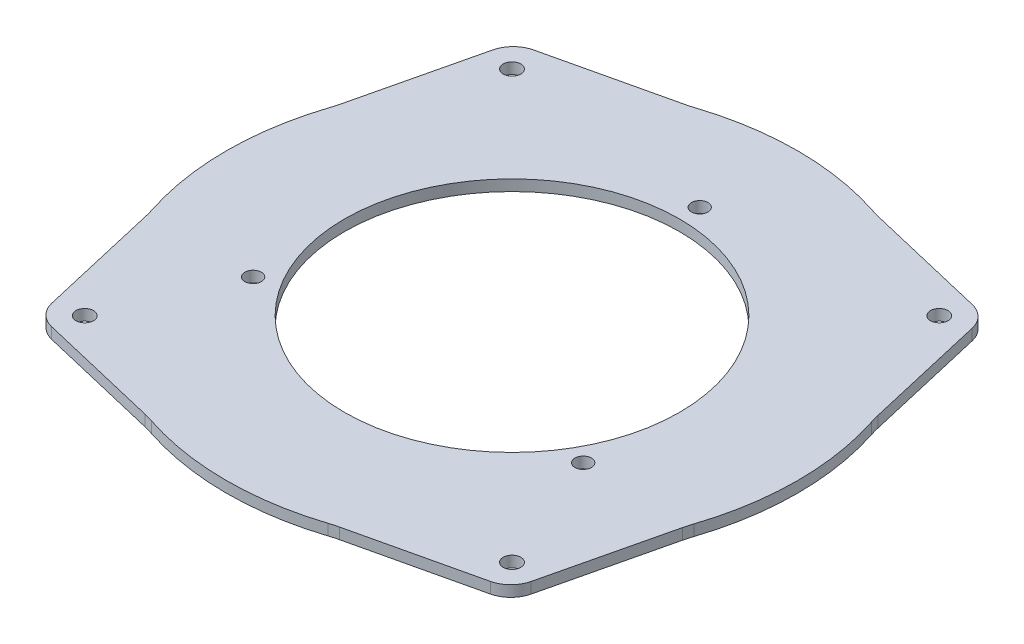
ISO-10303-21;
HEADER;
FILE_DESCRIPTION(('STEP AP214'),'2;1');
FILE_NAME('part.step','',(''),(''),'','','');
FILE_SCHEMA(('AUTOMOTIVE_DESIGN { 1 0 10303 214 1 1 1 1 }'));
ENDSEC;
DATA;
#1=APPLICATION_CONTEXT('core data for automotive mechanical design processes');
#2=APPLICATION_PROTOCOL_DEFINITION('international standard','automotive_design',2000,#1);
#3=PRODUCT_CONTEXT('',#1,'mechanical');
#4=PRODUCT('Part','Part','',(#3));
#5=PRODUCT_RELATED_PRODUCT_CATEGORY('part','',(#4));
#6=PRODUCT_DEFINITION_FORMATION('','',#4);
#7=PRODUCT_DEFINITION_CONTEXT('part definition',#1,'design');
#8=PRODUCT_DEFINITION('design','',#6,#7);
#9=PRODUCT_DEFINITION_SHAPE('','',#8);
#10=(LENGTH_UNIT() NAMED_UNIT(*) SI_UNIT(.MILLI.,.METRE.));
#11=(NAMED_UNIT(*) PLANE_ANGLE_UNIT() SI_UNIT($,.RADIAN.));
#12=(NAMED_UNIT(*) SI_UNIT($,.STERADIAN.) SOLID_ANGLE_UNIT());
#13=UNCERTAINTY_MEASURE_WITH_UNIT(LENGTH_MEASURE(1.E-05),#10,'distance_accuracy_value','');
#14=(GEOMETRIC_REPRESENTATION_CONTEXT(3) GLOBAL_UNCERTAINTY_ASSIGNED_CONTEXT((#13)) GLOBAL_UNIT_ASSIGNED_CONTEXT((#10,
#11,#12)) REPRESENTATION_CONTEXT('',''));
#15=CARTESIAN_POINT('',(0.,0.,0.));
#16=DIRECTION('',(0.,0.,1.));
#17=DIRECTION('',(1.,0.,0.));
#18=AXIS2_PLACEMENT_3D('',#15,#16,#17);
#19=CARTESIAN_POINT('',(-22.1453568798844,2.,-68.5097304670067));
#20=DIRECTION('',(0.,1.,0.));
#21=DIRECTION('',(0.,0.,1.));
#22=AXIS2_PLACEMENT_3D('',#19,#20,#21);
#23=PLANE('',#22);
#24=CARTESIAN_POINT('',(38.8907000000007,2.,38.8907000000005));
#25=DIRECTION('',(0.,1.,0.));
#26=DIRECTION('',(0.,0.,1.));
#27=AXIS2_PLACEMENT_3D('',#24,#25,#26);
#28=CIRCLE('',#27,1.6);
#29=CARTESIAN_POINT('',(38.8907000000007,2.,40.4907000000005));
#30=VERTEX_POINT('',#29);
#31=EDGE_CURVE('E527',#30,#30,#28,.T.);
#32=ORIENTED_EDGE('',*,*,#31,.F.);
#33=EDGE_LOOP('',(#32));
#34=FACE_BOUND('',#33,.T.);
#35=CARTESIAN_POINT('',(29.6726964084282,2.,16.7172515373909));
#36=DIRECTION('',(0.,1.,0.));
#37=DIRECTION('',(0.,0.,1.));
#38=AXIS2_PLACEMENT_3D('',#35,#36,#37);
#39=CIRCLE('',#38,1.5);
#40=CARTESIAN_POINT('',(29.6726964084282,2.,18.2172515373909));
#41=VERTEX_POINT('',#40);
#42=EDGE_CURVE('E511',#41,#41,#39,.T.);
#43=ORIENTED_EDGE('',*,*,#42,.F.);
#44=EDGE_LOOP('',(#43));
#45=FACE_BOUND('',#44,.T.);
#46=CARTESIAN_POINT('',(-38.8906999999993,2.,-38.8906999999996));
#47=DIRECTION('',(0.,1.,0.));
#48=DIRECTION('',(0.,0.,1.));
#49=AXIS2_PLACEMENT_3D('',#46,#47,#48);
#50=CIRCLE('',#49,1.6);
#51=CARTESIAN_POINT('',(-38.8906999999993,2.,-37.2906999999996));
#52=VERTEX_POINT('',#51);
#53=EDGE_CURVE('E495',#52,#52,#50,.T.);
#54=ORIENTED_EDGE('',*,*,#53,.F.);
#55=EDGE_LOOP('',(#54));
#56=FACE_BOUND('',#55,.T.);
#57=CARTESIAN_POINT('',(3.88578058618805E-13,2.,3.85108611666851E-13));
#58=DIRECTION('',(0.,1.,0.));
#59=DIRECTION('',(0.,0.,1.));
#60=AXIS2_PLACEMENT_3D('',#57,#58,#59);
#61=CIRCLE('',#60,30.5);
#62=CARTESIAN_POINT('',(3.88578058618805E-13,2.,30.5000000000004));
#63=VERTEX_POINT('',#62);
#64=EDGE_CURVE('E243',#63,#63,#61,.T.);
#65=ORIENTED_EDGE('',*,*,#64,.F.);
#66=EDGE_LOOP('',(#65));
#67=FACE_BOUND('',#66,.T.);
#68=CARTESIAN_POINT('',(-22.1453568798844,2.,-68.5097304670067));
#69=DIRECTION('',(0.,-1.,0.));
#70=DIRECTION('',(0.,0.,1.));
#71=AXIS2_PLACEMENT_3D('',#68,#69,#70);
#72=CIRCLE('',#71,20.);
#73=CARTESIAN_POINT('',(-15.9938688576939,2.,-49.4792497817258));
#74=VERTEX_POINT('',#73);
#75=CARTESIAN_POINT('',(-17.6338465789146,2.,-49.0252167495889));
#76=VERTEX_POINT('',#75);
#77=EDGE_CURVE('E310',#74,#76,#72,.T.);
#78=ORIENTED_EDGE('',*,*,#77,.T.);
#79=DIRECTION('',(-0.974225685870893,0.,0.225575515048483));
#80=VECTOR('',#79,1.);
#81=CARTESIAN_POINT('',(-39.9140995803705,2.,-43.8663715055106));
#82=LINE('',#81,#80);
#83=CARTESIAN_POINT('',(-39.9140995803705,2.,-43.8663715055106));
#84=VERTEX_POINT('',#83);
#85=EDGE_CURVE('E146',#76,#84,#82,.T.);
#86=ORIENTED_EDGE('',*,*,#85,.T.);
#87=CARTESIAN_POINT('',(-38.7862220051282,2.,-38.9952430761568));
#88=DIRECTION('',(0.,1.,0.));
#89=DIRECTION('',(0.,0.,1.));
#90=AXIS2_PLACEMENT_3D('',#87,#88,#89);
#91=CIRCLE('',#90,4.99999999999932);
#92=CARTESIAN_POINT('',(-43.651218264907,2.,-40.149284406583));
#93=VERTEX_POINT('',#92);
#94=EDGE_CURVE('E395',#84,#93,#91,.T.);
#95=ORIENTED_EDGE('',*,*,#94,.T.);
#96=DIRECTION('',(-0.230808266085291,0.,0.972999251955879));
#97=VECTOR('',#96,1.);
#98=CARTESIAN_POINT('',(-48.9297349759596,2.,-17.8970795856653));
#99=LINE('',#98,#97);
#100=CARTESIAN_POINT('',(-48.9297349759596,2.,-17.8970795856653));
#101=VERTEX_POINT('',#100);
#102=EDGE_CURVE('E413',#93,#101,#99,.T.);
#103=ORIENTED_EDGE('',*,*,#102,.T.);
#104=CARTESIAN_POINT('',(-68.3897200150771,2.,-22.5132449073711));
#105=DIRECTION('',(0.,-1.,0.));
#106=DIRECTION('',(0.,0.,1.));
#107=AXIS2_PLACEMENT_3D('',#104,#105,#106);
#108=CIRCLE('',#107,19.9999999999999);
#109=CARTESIAN_POINT('',(-49.3925755664448,2.,-16.259565766434));
#110=VERTEX_POINT('',#109);
#111=EDGE_CURVE('E409',#101,#110,#108,.T.);
#112=ORIENTED_EDGE('',*,*,#111,.T.);
#113=CARTESIAN_POINT('',(3.88578058618805E-13,2.,3.85108611666851E-13));
#114=DIRECTION('',(0.,1.,0.));
#115=DIRECTION('',(0.,0.,1.));
#116=AXIS2_PLACEMENT_3D('',#113,#114,#115);
#117=CIRCLE('',#116,52.);
#118=CARTESIAN_POINT('',(-49.4792497817297,2.,15.9938688576957));
#119=VERTEX_POINT('',#118);
#120=EDGE_CURVE('E412',#110,#119,#117,.T.);
#121=ORIENTED_EDGE('',*,*,#120,.T.);
#122=CARTESIAN_POINT('',(-68.5097304670106,2.,22.145356879886));
#123=DIRECTION('',(0.,-1.,0.));
#124=DIRECTION('',(0.,0.,1.));
#125=AXIS2_PLACEMENT_3D('',#122,#123,#124);
#126=CIRCLE('',#125,20.0000000000001);
#127=CARTESIAN_POINT('',(-49.0252167495927,2.,17.6338465789162));
#128=VERTEX_POINT('',#127);
#129=EDGE_CURVE('E417',#119,#128,#126,.T.);
#130=ORIENTED_EDGE('',*,*,#129,.T.);
#131=DIRECTION('',(0.225575515048492,0.,0.974225685870891));
#132=VECTOR('',#131,1.);
#133=CARTESIAN_POINT('',(-43.8663715055141,2.,39.9140995803726));
#134=LINE('',#133,#132);
#135=CARTESIAN_POINT('',(-43.8663715055141,2.,39.9140995803726));
#136=VERTEX_POINT('',#135);
#137=EDGE_CURVE('E424',#128,#136,#134,.T.);
#138=ORIENTED_EDGE('',*,*,#137,.T.);
#139=CARTESIAN_POINT('',(-38.9952430761602,2.,38.7862220051302));
#140=DIRECTION('',(0.,1.,0.));
#141=DIRECTION('',(0.,0.,1.));
#142=AXIS2_PLACEMENT_3D('',#139,#140,#141);
#143=CIRCLE('',#142,4.99999999999942);
#144=CARTESIAN_POINT('',(-40.1492844065865,2.,43.6512182649091));
#145=VERTEX_POINT('',#144);
#146=EDGE_CURVE('E427',#136,#145,#143,.T.);
#147=ORIENTED_EDGE('',*,*,#146,.T.);
#148=DIRECTION('',(0.972999251955882,0.,0.230808266085283));
#149=VECTOR('',#148,1.);
#150=CARTESIAN_POINT('',(-17.8970795856709,2.,48.9297349759609));
#151=LINE('',#150,#149);
#152=CARTESIAN_POINT('',(-17.8970795856709,2.,48.9297349759609));
#153=VERTEX_POINT('',#152);
#154=EDGE_CURVE('E430',#145,#153,#151,.T.);
#155=ORIENTED_EDGE('',*,*,#154,.T.);
#156=CARTESIAN_POINT('',(-22.5132449073765,2.,68.3897200150786));
#157=DIRECTION('',(0.,-1.,0.));
#158=DIRECTION('',(0.,0.,1.));
#159=AXIS2_PLACEMENT_3D('',#156,#157,#158);
#160=CIRCLE('',#159,20.);
#161=CARTESIAN_POINT('',(-16.2595657664402,2.,49.3925755664458));
#162=VERTEX_POINT('',#161);
#163=EDGE_CURVE('E433',#153,#162,#160,.T.);
#164=ORIENTED_EDGE('',*,*,#163,.T.);
#165=CARTESIAN_POINT('',(-4.50517509083709E-12,2.,2.29418633236077E-12));
#166=DIRECTION('',(0.,1.,0.));
#167=DIRECTION('',(0.,0.,1.));
#168=AXIS2_PLACEMENT_3D('',#165,#166,#167);
#169=CIRCLE('',#168,51.9999999999989);
#170=CARTESIAN_POINT('',(15.9938688576903,2.,49.4792497817314));
#171=VERTEX_POINT('',#170);
#172=EDGE_CURVE('E436',#162,#171,#169,.T.);
#173=ORIENTED_EDGE('',*,*,#172,.T.);
#174=CARTESIAN_POINT('',(22.1453568798804,2.,68.5097304670124));
#175=DIRECTION('',(0.,-1.,0.));
#176=DIRECTION('',(0.,0.,1.));
#177=AXIS2_PLACEMENT_3D('',#174,#175,#176);
#178=CIRCLE('',#177,20.);
#179=CARTESIAN_POINT('',(17.633846578909,2.,49.0252167495949));
#180=VERTEX_POINT('',#179);
#181=EDGE_CURVE('E439',#171,#180,#178,.T.);
#182=ORIENTED_EDGE('',*,*,#181,.T.);
#183=DIRECTION('',(0.974225685870891,0.,-0.22557551504849));
#184=VECTOR('',#183,1.);
#185=CARTESIAN_POINT('',(39.9140995803634,2.,43.8663715055168));
#186=LINE('',#185,#184);
#187=CARTESIAN_POINT('',(39.9140995803634,2.,43.8663715055168));
#188=VERTEX_POINT('',#187);
#189=EDGE_CURVE('E442',#180,#188,#186,.T.);
#190=ORIENTED_EDGE('',*,*,#189,.T.);
#191=CARTESIAN_POINT('',(38.7862220051211,2.,38.995243076163));
#192=DIRECTION('',(0.,1.,0.));
#193=DIRECTION('',(0.,0.,1.));
#194=AXIS2_PLACEMENT_3D('',#191,#192,#193);
#195=CIRCLE('',#194,4.99999999999953);
#196=CARTESIAN_POINT('',(43.6512182649001,2.,40.1492844065893));
#197=VERTEX_POINT('',#196);
#198=EDGE_CURVE('E445',#188,#197,#195,.T.);
#199=ORIENTED_EDGE('',*,*,#198,.T.);
#200=DIRECTION('',(0.230808266085281,0.,-0.972999251955882));
#201=VECTOR('',#200,1.);
#202=CARTESIAN_POINT('',(48.9297349759409,2.,17.8970795857211));
#203=LINE('',#202,#201);
#204=CARTESIAN_POINT('',(48.9297349759409,2.,17.8970795857211));
#205=VERTEX_POINT('',#204);
#206=EDGE_CURVE('E448',#197,#205,#203,.T.);
#207=ORIENTED_EDGE('',*,*,#206,.T.);
#208=CARTESIAN_POINT('',(68.3897200150589,2.,22.5132449074268));
#209=DIRECTION('',(0.,-1.,0.));
#210=DIRECTION('',(0.,0.,1.));
#211=AXIS2_PLACEMENT_3D('',#208,#209,#210);
#212=CIRCLE('',#211,20.0000000000004);
#213=CARTESIAN_POINT('',(49.3925755664309,2.,16.2595657664749));
#214=VERTEX_POINT('',#213);
#215=EDGE_CURVE('E451',#205,#214,#212,.T.);
#216=ORIENTED_EDGE('',*,*,#215,.T.);
#217=CARTESIAN_POINT('',(-1.04655030013431E-12,2.,2.06336822739891E-13));
#218=DIRECTION('',(0.,1.,0.));
#219=DIRECTION('',(0.,0.,1.));
#220=AXIS2_PLACEMENT_3D('',#217,#218,#219);
#221=CIRCLE('',#220,52.);
#222=CARTESIAN_POINT('',(49.4792497817234,2.,-15.993868857713));
#223=VERTEX_POINT('',#222);
#224=EDGE_CURVE('E454',#214,#223,#221,.T.);
#225=ORIENTED_EDGE('',*,*,#224,.T.);
#226=CARTESIAN_POINT('',(68.5097304670016,2.,-22.1453568799102));
#227=DIRECTION('',(0.,-1.,0.));
#228=DIRECTION('',(0.,0.,1.));
#229=AXIS2_PLACEMENT_3D('',#226,#227,#228);
#230=CIRCLE('',#229,19.9999999999995);
#231=CARTESIAN_POINT('',(49.0252167495842,2.,-17.6338465789407));
#232=VERTEX_POINT('',#231);
#233=EDGE_CURVE('E457',#223,#232,#230,.T.);
#234=ORIENTED_EDGE('',*,*,#233,.T.);
#235=DIRECTION('',(-0.22557551504848,0.,-0.974225685870894));
#236=VECTOR('',#235,1.);
#237=CARTESIAN_POINT('',(43.8663715055134,2.,-39.9140995803654));
#238=LINE('',#237,#236);
#239=CARTESIAN_POINT('',(43.8663715055134,2.,-39.9140995803654));
#240=VERTEX_POINT('',#239);
#241=EDGE_CURVE('E460',#232,#240,#238,.T.);
#242=ORIENTED_EDGE('',*,*,#241,.T.);
#243=CARTESIAN_POINT('',(38.9952430761595,2.,-38.7862220051232));
#244=DIRECTION('',(0.,1.,0.));
#245=DIRECTION('',(0.,0.,1.));
#246=AXIS2_PLACEMENT_3D('',#243,#244,#245);
#247=CIRCLE('',#246,4.9999999999994);
#248=CARTESIAN_POINT('',(40.1492844065859,2.,-43.651218264902));
#249=VERTEX_POINT('',#248);
#250=EDGE_CURVE('E214',#240,#249,#247,.T.);
#251=ORIENTED_EDGE('',*,*,#250,.T.);
#252=DIRECTION('',(-0.97299925195588,0.,-0.230808266085289));
#253=VECTOR('',#252,1.);
#254=CARTESIAN_POINT('',(17.897079585663,2.,-48.9297349759557));
#255=LINE('',#254,#253);
#256=CARTESIAN_POINT('',(17.897079585663,2.,-48.9297349759557));
#257=VERTEX_POINT('',#256);
#258=EDGE_CURVE('E207',#249,#257,#255,.T.);
#259=ORIENTED_EDGE('',*,*,#258,.T.);
#260=CARTESIAN_POINT('',(22.5132449073689,2.,-68.3897200150733));
#261=DIRECTION('',(0.,-1.,0.));
#262=DIRECTION('',(0.,0.,1.));
#263=AXIS2_PLACEMENT_3D('',#260,#261,#262);
#264=CIRCLE('',#263,19.9999999999999);
#265=CARTESIAN_POINT('',(16.2595657664326,2.,-49.3925755664406));
#266=VERTEX_POINT('',#265);
#267=EDGE_CURVE('E211',#257,#266,#264,.T.);
#268=ORIENTED_EDGE('',*,*,#267,.T.);
#269=CARTESIAN_POINT('',(-2.29687533889309E-12,2.,4.40669160380655E-12));
#270=DIRECTION('',(0.,1.,0.));
#271=DIRECTION('',(0.,0.,1.));
#272=AXIS2_PLACEMENT_3D('',#269,#270,#271);
#273=CIRCLE('',#272,52.);
#274=EDGE_CURVE('E57',#266,#74,#273,.T.);
#275=ORIENTED_EDGE('',*,*,#274,.T.);
#276=EDGE_LOOP('',(#78,#86,#95,#103,#112,#121,#130,#138,#147,#155,#164,#173,#182,#190,#199,#207,
#216,#225,#234,#242,#251,#259,#268,#275));
#277=FACE_BOUND('',#276,.T.);
#278=CARTESIAN_POINT('',(7.07767178198537E-13,2.,-34.173997099809));
#279=DIRECTION('',(0.,1.,0.));
#280=DIRECTION('',(0.,0.,1.));
#281=AXIS2_PLACEMENT_3D('',#278,#279,#280);
#282=CIRCLE('',#281,1.5);
#283=CARTESIAN_POINT('',(7.07767178198537E-13,2.,-32.673997099809));
#284=VERTEX_POINT('',#283);
#285=EDGE_CURVE('E487',#284,#284,#282,.T.);
#286=ORIENTED_EDGE('',*,*,#285,.F.);
#287=EDGE_LOOP('',(#286));
#288=FACE_BOUND('',#287,.T.);
#289=CARTESIAN_POINT('',(-29.6726964084278,2.,17.4567455624193));
#290=DIRECTION('',(0.,1.,0.));
#291=DIRECTION('',(0.,0.,1.));
#292=AXIS2_PLACEMENT_3D('',#289,#290,#291);
#293=CIRCLE('',#292,1.5);
#294=CARTESIAN_POINT('',(-29.6726964084278,2.,18.9567455624193));
#295=VERTEX_POINT('',#294);
#296=EDGE_CURVE('E503',#295,#295,#293,.T.);
#297=ORIENTED_EDGE('',*,*,#296,.F.);
#298=EDGE_LOOP('',(#297));
#299=FACE_BOUND('',#298,.T.);
#300=CARTESIAN_POINT('',(38.8907000000007,2.,-38.8906999999996));
#301=DIRECTION('',(0.,1.,0.));
#302=DIRECTION('',(0.,0.,-1.));
#303=AXIS2_PLACEMENT_3D('',#300,#301,#302);
#304=CIRCLE('',#303,1.6);
#305=CARTESIAN_POINT('',(38.8907000000007,2.,-40.4906999999996));
#306=VERTEX_POINT('',#305);
#307=EDGE_CURVE('E519',#306,#306,#304,.T.);
#308=ORIENTED_EDGE('',*,*,#307,.F.);
#309=EDGE_LOOP('',(#308));
#310=FACE_BOUND('',#309,.T.);
#311=CARTESIAN_POINT('',(-38.8906999999993,2.,38.8907000000005));
#312=DIRECTION('',(0.,1.,0.));
#313=DIRECTION('',(0.,0.,-1.));
#314=AXIS2_PLACEMENT_3D('',#311,#312,#313);
#315=CIRCLE('',#314,1.6);
#316=CARTESIAN_POINT('',(-38.8906999999993,2.,37.2907000000005));
#317=VERTEX_POINT('',#316);
#318=EDGE_CURVE('E535',#317,#317,#315,.T.);
#319=ORIENTED_EDGE('',*,*,#318,.F.);
#320=EDGE_LOOP('',(#319));
#321=FACE_BOUND('',#320,.T.);
#322=ADVANCED_FACE('F39',(#34,#45,#56,#67,#277,#288,#299,#310,#321),#23,.T.);
#323=CARTESIAN_POINT('',(-22.1453568798844,0.,-68.5097304670067));
#324=DIRECTION('',(0.,1.,0.));
#325=DIRECTION('',(0.,0.,1.));
#326=AXIS2_PLACEMENT_3D('',#323,#324,#325);
#327=PLANE('',#326);
#328=CARTESIAN_POINT('',(-22.1453568798844,0.,-68.5097304670067));
#329=DIRECTION('',(0.,-1.,0.));
#330=DIRECTION('',(0.,0.,1.));
#331=AXIS2_PLACEMENT_3D('',#328,#329,#330);
#332=CIRCLE('',#331,20.);
#333=CARTESIAN_POINT('',(-15.9938688576939,0.,-49.4792497817258));
#334=VERTEX_POINT('',#333);
#335=CARTESIAN_POINT('',(-17.6338465789146,0.,-49.0252167495889));
#336=VERTEX_POINT('',#335);
#337=EDGE_CURVE('E238',#334,#336,#332,.T.);
#338=ORIENTED_EDGE('',*,*,#337,.F.);
#339=CARTESIAN_POINT('',(3.88578058618805E-13,0.,3.85108611666851E-13));
#340=DIRECTION('',(0.,1.,0.));
#341=DIRECTION('',(0.,0.,1.));
#342=AXIS2_PLACEMENT_3D('',#339,#340,#341);
#343=CIRCLE('',#342,51.9999999999959);
#344=CARTESIAN_POINT('',(16.2595657664326,0.,-49.3925755664406));
#345=VERTEX_POINT('',#344);
#346=EDGE_CURVE('E134',#345,#334,#343,.T.);
#347=ORIENTED_EDGE('',*,*,#346,.F.);
#348=CARTESIAN_POINT('',(22.5132449073689,0.,-68.3897200150733));
#349=DIRECTION('',(0.,-1.,0.));
#350=DIRECTION('',(0.,0.,1.));
#351=AXIS2_PLACEMENT_3D('',#348,#349,#350);
#352=CIRCLE('',#351,19.9999999999999);
#353=CARTESIAN_POINT('',(17.897079585663,0.,-48.9297349759557));
#354=VERTEX_POINT('',#353);
#355=EDGE_CURVE('E305',#354,#345,#352,.T.);
#356=ORIENTED_EDGE('',*,*,#355,.F.);
#357=DIRECTION('',(-0.97299925195588,0.,-0.230808266085289));
#358=VECTOR('',#357,1.);
#359=CARTESIAN_POINT('',(17.897079585663,0.,-48.9297349759557));
#360=LINE('',#359,#358);
#361=CARTESIAN_POINT('',(40.1492844065859,0.,-43.651218264902));
#362=VERTEX_POINT('',#361);
#363=EDGE_CURVE('E224',#362,#354,#360,.T.);
#364=ORIENTED_EDGE('',*,*,#363,.F.);
#365=CARTESIAN_POINT('',(38.9952430761595,0.,-38.7862220051232));
#366=DIRECTION('',(0.,1.,0.));
#367=DIRECTION('',(0.,0.,1.));
#368=AXIS2_PLACEMENT_3D('',#365,#366,#367);
#369=CIRCLE('',#368,4.9999999999994);
#370=CARTESIAN_POINT('',(43.8663715055134,0.,-39.9140995803654));
#371=VERTEX_POINT('',#370);
#372=EDGE_CURVE('E300',#371,#362,#369,.T.);
#373=ORIENTED_EDGE('',*,*,#372,.F.);
#374=DIRECTION('',(-0.22557551504848,0.,-0.974225685870894));
#375=VECTOR('',#374,1.);
#376=CARTESIAN_POINT('',(43.8663715055134,0.,-39.9140995803654));
#377=LINE('',#376,#375);
#378=CARTESIAN_POINT('',(49.0252167495842,0.,-17.6338465789407));
#379=VERTEX_POINT('',#378);
#380=EDGE_CURVE('E297',#379,#371,#377,.T.);
#381=ORIENTED_EDGE('',*,*,#380,.F.);
#382=CARTESIAN_POINT('',(68.5097304670016,0.,-22.1453568799102));
#383=DIRECTION('',(0.,-1.,0.));
#384=DIRECTION('',(0.,0.,1.));
#385=AXIS2_PLACEMENT_3D('',#382,#383,#384);
#386=CIRCLE('',#385,19.9999999999995);
#387=CARTESIAN_POINT('',(49.4792497817234,0.,-15.993868857713));
#388=VERTEX_POINT('',#387);
#389=EDGE_CURVE('E294',#388,#379,#386,.T.);
#390=ORIENTED_EDGE('',*,*,#389,.F.);
#391=CARTESIAN_POINT('',(-1.04655030013431E-12,0.,2.06336822739891E-13));
#392=DIRECTION('',(0.,1.,0.));
#393=DIRECTION('',(0.,0.,1.));
#394=AXIS2_PLACEMENT_3D('',#391,#392,#393);
#395=CIRCLE('',#394,52.);
#396=CARTESIAN_POINT('',(49.3925755664309,0.,16.2595657664749));
#397=VERTEX_POINT('',#396);
#398=EDGE_CURVE('E291',#397,#388,#395,.T.);
#399=ORIENTED_EDGE('',*,*,#398,.F.);
#400=CARTESIAN_POINT('',(68.3897200150589,0.,22.5132449074268));
#401=DIRECTION('',(0.,-1.,0.));
#402=DIRECTION('',(0.,0.,1.));
#403=AXIS2_PLACEMENT_3D('',#400,#401,#402);
#404=CIRCLE('',#403,20.0000000000004);
#405=CARTESIAN_POINT('',(48.9297349759409,0.,17.8970795857211));
#406=VERTEX_POINT('',#405);
#407=EDGE_CURVE('E288',#406,#397,#404,.T.);
#408=ORIENTED_EDGE('',*,*,#407,.F.);
#409=DIRECTION('',(0.230808266085281,0.,-0.972999251955882));
#410=VECTOR('',#409,1.);
#411=CARTESIAN_POINT('',(48.9297349759409,0.,17.8970795857211));
#412=LINE('',#411,#410);
#413=CARTESIAN_POINT('',(43.6512182649001,0.,40.1492844065893));
#414=VERTEX_POINT('',#413);
#415=EDGE_CURVE('E285',#414,#406,#412,.T.);
#416=ORIENTED_EDGE('',*,*,#415,.F.);
#417=CARTESIAN_POINT('',(38.7862220051211,0.,38.995243076163));
#418=DIRECTION('',(0.,1.,0.));
#419=DIRECTION('',(0.,0.,1.));
#420=AXIS2_PLACEMENT_3D('',#417,#418,#419);
#421=CIRCLE('',#420,4.99999999999953);
#422=CARTESIAN_POINT('',(39.9140995803634,0.,43.8663715055168));
#423=VERTEX_POINT('',#422);
#424=EDGE_CURVE('E282',#423,#414,#421,.T.);
#425=ORIENTED_EDGE('',*,*,#424,.F.);
#426=DIRECTION('',(0.974225685870891,0.,-0.22557551504849));
#427=VECTOR('',#426,1.);
#428=CARTESIAN_POINT('',(39.9140995803634,0.,43.8663715055168));
#429=LINE('',#428,#427);
#430=CARTESIAN_POINT('',(17.633846578909,0.,49.0252167495949));
#431=VERTEX_POINT('',#430);
#432=EDGE_CURVE('E279',#431,#423,#429,.T.);
#433=ORIENTED_EDGE('',*,*,#432,.F.);
#434=CARTESIAN_POINT('',(22.1453568798804,0.,68.5097304670124));
#435=DIRECTION('',(0.,-1.,0.));
#436=DIRECTION('',(0.,0.,1.));
#437=AXIS2_PLACEMENT_3D('',#434,#435,#436);
#438=CIRCLE('',#437,20.);
#439=CARTESIAN_POINT('',(15.9938688576903,0.,49.4792497817314));
#440=VERTEX_POINT('',#439);
#441=EDGE_CURVE('E276',#440,#431,#438,.T.);
#442=ORIENTED_EDGE('',*,*,#441,.F.);
#443=CARTESIAN_POINT('',(-4.50517509083709E-12,0.,2.29418633236077E-12));
#444=DIRECTION('',(0.,1.,0.));
#445=DIRECTION('',(0.,0.,1.));
#446=AXIS2_PLACEMENT_3D('',#443,#444,#445);
#447=CIRCLE('',#446,51.9999999999989);
#448=CARTESIAN_POINT('',(-16.2595657664402,0.,49.3925755664458));
#449=VERTEX_POINT('',#448);
#450=EDGE_CURVE('E273',#449,#440,#447,.T.);
#451=ORIENTED_EDGE('',*,*,#450,.F.);
#452=CARTESIAN_POINT('',(-22.5132449073765,0.,68.3897200150786));
#453=DIRECTION('',(0.,-1.,0.));
#454=DIRECTION('',(0.,0.,1.));
#455=AXIS2_PLACEMENT_3D('',#452,#453,#454);
#456=CIRCLE('',#455,20.);
#457=CARTESIAN_POINT('',(-17.8970795856709,0.,48.9297349759609));
#458=VERTEX_POINT('',#457);
#459=EDGE_CURVE('E270',#458,#449,#456,.T.);
#460=ORIENTED_EDGE('',*,*,#459,.F.);
#461=DIRECTION('',(0.972999251955882,0.,0.230808266085283));
#462=VECTOR('',#461,1.);
#463=CARTESIAN_POINT('',(-17.8970795856709,0.,48.9297349759609));
#464=LINE('',#463,#462);
#465=CARTESIAN_POINT('',(-40.1492844065865,0.,43.6512182649091));
#466=VERTEX_POINT('',#465);
#467=EDGE_CURVE('E267',#466,#458,#464,.T.);
#468=ORIENTED_EDGE('',*,*,#467,.F.);
#469=CARTESIAN_POINT('',(-38.9952430761602,0.,38.7862220051302));
#470=DIRECTION('',(0.,1.,0.));
#471=DIRECTION('',(0.,0.,1.));
#472=AXIS2_PLACEMENT_3D('',#469,#470,#471);
#473=CIRCLE('',#472,4.99999999999942);
#474=CARTESIAN_POINT('',(-43.8663715055141,0.,39.9140995803726));
#475=VERTEX_POINT('',#474);
#476=EDGE_CURVE('E264',#475,#466,#473,.T.);
#477=ORIENTED_EDGE('',*,*,#476,.F.);
#478=DIRECTION('',(0.225575515048492,0.,0.974225685870891));
#479=VECTOR('',#478,1.);
#480=CARTESIAN_POINT('',(-43.8663715055141,0.,39.9140995803726));
#481=LINE('',#480,#479);
#482=CARTESIAN_POINT('',(-49.0252167495927,0.,17.6338465789162));
#483=VERTEX_POINT('',#482);
#484=EDGE_CURVE('E261',#483,#475,#481,.T.);
#485=ORIENTED_EDGE('',*,*,#484,.F.);
#486=CARTESIAN_POINT('',(-68.5097304670106,0.,22.145356879886));
#487=DIRECTION('',(0.,-1.,0.));
#488=DIRECTION('',(0.,0.,1.));
#489=AXIS2_PLACEMENT_3D('',#486,#487,#488);
#490=CIRCLE('',#489,20.0000000000001);
#491=CARTESIAN_POINT('',(-49.4792497817297,0.,15.9938688576957));
#492=VERTEX_POINT('',#491);
#493=EDGE_CURVE('E258',#492,#483,#490,.T.);
#494=ORIENTED_EDGE('',*,*,#493,.F.);
#495=CARTESIAN_POINT('',(3.88578058618805E-13,0.,3.85108611666851E-13));
#496=DIRECTION('',(0.,1.,0.));
#497=DIRECTION('',(0.,0.,1.));
#498=AXIS2_PLACEMENT_3D('',#495,#496,#497);
#499=CIRCLE('',#498,52.);
#500=CARTESIAN_POINT('',(-49.3925755664448,0.,-16.259565766434));
#501=VERTEX_POINT('',#500);
#502=EDGE_CURVE('E255',#501,#492,#499,.T.);
#503=ORIENTED_EDGE('',*,*,#502,.F.);
#504=CARTESIAN_POINT('',(-68.3897200150771,0.,-22.5132449073711));
#505=DIRECTION('',(0.,-1.,0.));
#506=DIRECTION('',(0.,0.,1.));
#507=AXIS2_PLACEMENT_3D('',#504,#505,#506);
#508=CIRCLE('',#507,19.9999999999999);
#509=CARTESIAN_POINT('',(-48.9297349759596,0.,-17.8970795856653));
#510=VERTEX_POINT('',#509);
#511=EDGE_CURVE('E252',#510,#501,#508,.T.);
#512=ORIENTED_EDGE('',*,*,#511,.F.);
#513=DIRECTION('',(-0.230808266085291,0.,0.972999251955879));
#514=VECTOR('',#513,1.);
#515=CARTESIAN_POINT('',(-48.9297349759596,0.,-17.8970795856653));
#516=LINE('',#515,#514);
#517=CARTESIAN_POINT('',(-43.651218264907,0.,-40.149284406583));
#518=VERTEX_POINT('',#517);
#519=EDGE_CURVE('E249',#518,#510,#516,.T.);
#520=ORIENTED_EDGE('',*,*,#519,.F.);
#521=CARTESIAN_POINT('',(-38.7862220051282,0.,-38.9952430761568));
#522=DIRECTION('',(0.,1.,0.));
#523=DIRECTION('',(0.,0.,1.));
#524=AXIS2_PLACEMENT_3D('',#521,#522,#523);
#525=CIRCLE('',#524,4.99999999999932);
#526=CARTESIAN_POINT('',(-39.9140995803705,0.,-43.8663715055106));
#527=VERTEX_POINT('',#526);
#528=EDGE_CURVE('E246',#527,#518,#525,.T.);
#529=ORIENTED_EDGE('',*,*,#528,.F.);
#530=DIRECTION('',(-0.974225685870893,0.,0.225575515048483));
#531=VECTOR('',#530,1.);
#532=CARTESIAN_POINT('',(-39.9140995803705,0.,-43.8663715055106));
#533=LINE('',#532,#531);
#534=EDGE_CURVE('E242',#336,#527,#533,.T.);
#535=ORIENTED_EDGE('',*,*,#534,.F.);
#536=EDGE_LOOP('',(#338,#347,#356,#364,#373,#381,#390,#399,#408,#416,#425,#433,#442,#451,#460,
#468,#477,#485,#494,#503,#512,#520,#529,#535));
#537=FACE_BOUND('',#536,.T.);
#538=CARTESIAN_POINT('',(3.88578058618805E-13,0.,3.85108611666851E-13));
#539=DIRECTION('',(0.,1.,0.));
#540=DIRECTION('',(0.,0.,1.));
#541=AXIS2_PLACEMENT_3D('',#538,#539,#540);
#542=CIRCLE('',#541,30.5);
#543=CARTESIAN_POINT('',(3.88578058618805E-13,0.,30.5000000000004));
#544=VERTEX_POINT('',#543);
#545=EDGE_CURVE('E482',#544,#544,#542,.T.);
#546=ORIENTED_EDGE('',*,*,#545,.T.);
#547=EDGE_LOOP('',(#546));
#548=FACE_BOUND('',#547,.T.);
#549=CARTESIAN_POINT('',(7.07767178198537E-13,0.,-34.173997099809));
#550=DIRECTION('',(0.,1.,0.));
#551=DIRECTION('',(0.,0.,1.));
#552=AXIS2_PLACEMENT_3D('',#549,#550,#551);
#553=CIRCLE('',#552,1.5);
#554=CARTESIAN_POINT('',(7.07767178198537E-13,0.,-32.673997099809));
#555=VERTEX_POINT('',#554);
#556=EDGE_CURVE('E491',#555,#555,#553,.T.);
#557=ORIENTED_EDGE('',*,*,#556,.T.);
#558=EDGE_LOOP('',(#557));
#559=FACE_BOUND('',#558,.T.);
#560=CARTESIAN_POINT('',(-38.8906999999993,0.,-38.8906999999996));
#561=DIRECTION('',(0.,1.,0.));
#562=DIRECTION('',(0.,0.,1.));
#563=AXIS2_PLACEMENT_3D('',#560,#561,#562);
#564=CIRCLE('',#563,1.6);
#565=CARTESIAN_POINT('',(-38.8906999999993,0.,-37.2906999999996));
#566=VERTEX_POINT('',#565);
#567=EDGE_CURVE('E499',#566,#566,#564,.T.);
#568=ORIENTED_EDGE('',*,*,#567,.T.);
#569=EDGE_LOOP('',(#568));
#570=FACE_BOUND('',#569,.T.);
#571=CARTESIAN_POINT('',(-29.6726964084278,0.,17.4567455624193));
#572=DIRECTION('',(0.,1.,0.));
#573=DIRECTION('',(0.,0.,1.));
#574=AXIS2_PLACEMENT_3D('',#571,#572,#573);
#575=CIRCLE('',#574,1.5);
#576=CARTESIAN_POINT('',(-29.6726964084278,0.,18.9567455624193));
#577=VERTEX_POINT('',#576);
#578=EDGE_CURVE('E507',#577,#577,#575,.T.);
#579=ORIENTED_EDGE('',*,*,#578,.T.);
#580=EDGE_LOOP('',(#579));
#581=FACE_BOUND('',#580,.T.);
#582=CARTESIAN_POINT('',(29.6726964084282,0.,16.7172515373909));
#583=DIRECTION('',(0.,1.,0.));
#584=DIRECTION('',(0.,0.,1.));
#585=AXIS2_PLACEMENT_3D('',#582,#583,#584);
#586=CIRCLE('',#585,1.5);
#587=CARTESIAN_POINT('',(29.6726964084282,0.,18.2172515373909));
#588=VERTEX_POINT('',#587);
#589=EDGE_CURVE('E515',#588,#588,#586,.T.);
#590=ORIENTED_EDGE('',*,*,#589,.T.);
#591=EDGE_LOOP('',(#590));
#592=FACE_BOUND('',#591,.T.);
#593=CARTESIAN_POINT('',(38.8907000000007,0.,-38.8906999999996));
#594=DIRECTION('',(0.,1.,0.));
#595=DIRECTION('',(0.,0.,-1.));
#596=AXIS2_PLACEMENT_3D('',#593,#594,#595);
#597=CIRCLE('',#596,1.6);
#598=CARTESIAN_POINT('',(38.8907000000007,0.,-40.4906999999996));
#599=VERTEX_POINT('',#598);
#600=EDGE_CURVE('E523',#599,#599,#597,.T.);
#601=ORIENTED_EDGE('',*,*,#600,.T.);
#602=EDGE_LOOP('',(#601));
#603=FACE_BOUND('',#602,.T.);
#604=CARTESIAN_POINT('',(38.8907000000007,0.,38.8907000000005));
#605=DIRECTION('',(0.,1.,0.));
#606=DIRECTION('',(0.,0.,1.));
#607=AXIS2_PLACEMENT_3D('',#604,#605,#606);
#608=CIRCLE('',#607,1.6);
#609=CARTESIAN_POINT('',(38.8907000000007,0.,40.4907000000005));
#610=VERTEX_POINT('',#609);
#611=EDGE_CURVE('E531',#610,#610,#608,.T.);
#612=ORIENTED_EDGE('',*,*,#611,.T.);
#613=EDGE_LOOP('',(#612));
#614=FACE_BOUND('',#613,.T.);
#615=CARTESIAN_POINT('',(-38.8906999999993,0.,38.8907000000005));
#616=DIRECTION('',(0.,1.,0.));
#617=DIRECTION('',(0.,0.,-1.));
#618=AXIS2_PLACEMENT_3D('',#615,#616,#617);
#619=CIRCLE('',#618,1.6);
#620=CARTESIAN_POINT('',(-38.8906999999993,0.,37.2907000000005));
#621=VERTEX_POINT('',#620);
#622=EDGE_CURVE('E539',#621,#621,#619,.T.);
#623=ORIENTED_EDGE('',*,*,#622,.T.);
#624=EDGE_LOOP('',(#623));
#625=FACE_BOUND('',#624,.T.);
#626=ADVANCED_FACE('F397',(#537,#548,#559,#570,#581,#592,#603,#614,#625),#327,.F.);
#627=CARTESIAN_POINT('',(-22.1453568798844,2.,-68.5097304670067));
#628=DIRECTION('',(0.,-1.,0.));
#629=DIRECTION('',(0.,0.,-1.));
#630=AXIS2_PLACEMENT_3D('',#627,#628,#629);
#631=CYLINDRICAL_SURFACE('',#630,20.);
#632=ORIENTED_EDGE('',*,*,#337,.T.);
#633=DIRECTION('',(0.,-1.,0.));
#634=VECTOR('',#633,1.);
#635=CARTESIAN_POINT('',(-17.6338465789146,2.,-49.0252167495889));
#636=LINE('',#635,#634);
#637=EDGE_CURVE('E11',#76,#336,#636,.T.);
#638=ORIENTED_EDGE('',*,*,#637,.F.);
#639=ORIENTED_EDGE('',*,*,#77,.F.);
#640=DIRECTION('',(0.,-1.,0.));
#641=VECTOR('',#640,1.);
#642=CARTESIAN_POINT('',(-15.9938688576939,2.,-49.4792497817258));
#643=LINE('',#642,#641);
#644=EDGE_CURVE('E234',#74,#334,#643,.T.);
#645=ORIENTED_EDGE('',*,*,#644,.T.);
#646=EDGE_LOOP('',(#632,#638,#639,#645));
#647=FACE_BOUND('',#646,.T.);
#648=ADVANCED_FACE('F41',(#647),#631,.F.);
#649=CARTESIAN_POINT('',(-39.9140995803705,2.,-43.8663715055106));
#650=DIRECTION('',(0.225575515048483,0.,0.974225685870893));
#651=DIRECTION('',(0.974225685870893,0.,-0.225575515048483));
#652=AXIS2_PLACEMENT_3D('',#649,#650,#651);
#653=PLANE('',#652);
#654=ORIENTED_EDGE('',*,*,#534,.T.);
#655=DIRECTION('',(0.,-1.,0.));
#656=VECTOR('',#655,1.);
#657=CARTESIAN_POINT('',(-39.9140995803705,2.,-43.8663715055106));
#658=LINE('',#657,#656);
#659=EDGE_CURVE('E49',#84,#527,#658,.T.);
#660=ORIENTED_EDGE('',*,*,#659,.F.);
#661=ORIENTED_EDGE('',*,*,#85,.F.);
#662=ORIENTED_EDGE('',*,*,#637,.T.);
#663=EDGE_LOOP('',(#654,#660,#661,#662));
#664=FACE_BOUND('',#663,.T.);
#665=ADVANCED_FACE('F634',(#664),#653,.F.);
#666=CARTESIAN_POINT('',(-38.7862220051282,2.,-38.9952430761568));
#667=DIRECTION('',(0.,-1.,0.));
#668=DIRECTION('',(0.,0.,-1.));
#669=AXIS2_PLACEMENT_3D('',#666,#667,#668);
#670=CYLINDRICAL_SURFACE('',#669,4.99999999999932);
#671=ORIENTED_EDGE('',*,*,#528,.T.);
#672=DIRECTION('',(0.,-1.,0.));
#673=VECTOR('',#672,1.);
#674=CARTESIAN_POINT('',(-43.651218264907,2.,-40.149284406583));
#675=LINE('',#674,#673);
#676=EDGE_CURVE('E385',#93,#518,#675,.T.);
#677=ORIENTED_EDGE('',*,*,#676,.F.);
#678=ORIENTED_EDGE('',*,*,#94,.F.);
#679=ORIENTED_EDGE('',*,*,#659,.T.);
#680=EDGE_LOOP('',(#671,#677,#678,#679));
#681=FACE_BOUND('',#680,.T.);
#682=ADVANCED_FACE('F393',(#681),#670,.T.);
#683=CARTESIAN_POINT('',(-48.9297349759596,2.,-17.8970795856653));
#684=DIRECTION('',(0.97299925195588,0.,0.230808266085291));
#685=DIRECTION('',(0.230808266085291,0.,-0.97299925195588));
#686=AXIS2_PLACEMENT_3D('',#683,#684,#685);
#687=PLANE('',#686);
#688=ORIENTED_EDGE('',*,*,#519,.T.);
#689=DIRECTION('',(0.,-1.,0.));
#690=VECTOR('',#689,1.);
#691=CARTESIAN_POINT('',(-48.9297349759596,2.,-17.8970795856653));
#692=LINE('',#691,#690);
#693=EDGE_CURVE('E381',#101,#510,#692,.T.);
#694=ORIENTED_EDGE('',*,*,#693,.F.);
#695=ORIENTED_EDGE('',*,*,#102,.F.);
#696=ORIENTED_EDGE('',*,*,#676,.T.);
#697=EDGE_LOOP('',(#688,#694,#695,#696));
#698=FACE_BOUND('',#697,.T.);
#699=ADVANCED_FACE('F403',(#698),#687,.F.);
#700=CARTESIAN_POINT('',(-68.3897200150771,2.,-22.5132449073711));
#701=DIRECTION('',(0.,-1.,0.));
#702=DIRECTION('',(0.,0.,-1.));
#703=AXIS2_PLACEMENT_3D('',#700,#701,#702);
#704=CYLINDRICAL_SURFACE('',#703,19.9999999999999);
#705=ORIENTED_EDGE('',*,*,#511,.T.);
#706=DIRECTION('',(0.,-1.,0.));
#707=VECTOR('',#706,1.);
#708=CARTESIAN_POINT('',(-49.3925755664448,2.,-16.259565766434));
#709=LINE('',#708,#707);
#710=EDGE_CURVE('E377',#110,#501,#709,.T.);
#711=ORIENTED_EDGE('',*,*,#710,.F.);
#712=ORIENTED_EDGE('',*,*,#111,.F.);
#713=ORIENTED_EDGE('',*,*,#693,.T.);
#714=EDGE_LOOP('',(#705,#711,#712,#713));
#715=FACE_BOUND('',#714,.T.);
#716=ADVANCED_FACE('F407',(#715),#704,.F.);
#717=CARTESIAN_POINT('',(3.88578058618805E-13,2.,3.85108611666851E-13));
#718=DIRECTION('',(0.,-1.,0.));
#719=DIRECTION('',(0.,0.,-1.));
#720=AXIS2_PLACEMENT_3D('',#717,#718,#719);
#721=CYLINDRICAL_SURFACE('',#720,52.);
#722=ORIENTED_EDGE('',*,*,#502,.T.);
#723=DIRECTION('',(0.,-1.,0.));
#724=VECTOR('',#723,1.);
#725=CARTESIAN_POINT('',(-49.4792497817297,2.,15.9938688576957));
#726=LINE('',#725,#724);
#727=EDGE_CURVE('E373',#119,#492,#726,.T.);
#728=ORIENTED_EDGE('',*,*,#727,.F.);
#729=ORIENTED_EDGE('',*,*,#120,.F.);
#730=ORIENTED_EDGE('',*,*,#710,.T.);
#731=EDGE_LOOP('',(#722,#728,#729,#730));
#732=FACE_BOUND('',#731,.T.);
#733=ADVANCED_FACE('F624',(#732),#721,.T.);
#734=CARTESIAN_POINT('',(-68.5097304670106,2.,22.145356879886));
#735=DIRECTION('',(0.,-1.,0.));
#736=DIRECTION('',(0.,0.,-1.));
#737=AXIS2_PLACEMENT_3D('',#734,#735,#736);
#738=CYLINDRICAL_SURFACE('',#737,20.0000000000001);
#739=ORIENTED_EDGE('',*,*,#493,.T.);
#740=DIRECTION('',(0.,-1.,0.));
#741=VECTOR('',#740,1.);
#742=CARTESIAN_POINT('',(-49.0252167495927,2.,17.6338465789162));
#743=LINE('',#742,#741);
#744=EDGE_CURVE('E369',#128,#483,#743,.T.);
#745=ORIENTED_EDGE('',*,*,#744,.F.);
#746=ORIENTED_EDGE('',*,*,#129,.F.);
#747=ORIENTED_EDGE('',*,*,#727,.T.);
#748=EDGE_LOOP('',(#739,#745,#746,#747));
#749=FACE_BOUND('',#748,.T.);
#750=ADVANCED_FACE('F620',(#749),#738,.F.);
#751=CARTESIAN_POINT('',(-43.8663715055141,2.,39.9140995803726));
#752=DIRECTION('',(0.974225685870891,0.,-0.225575515048492));
#753=DIRECTION('',(-0.225575515048492,0.,-0.974225685870891));
#754=AXIS2_PLACEMENT_3D('',#751,#752,#753);
#755=PLANE('',#754);
#756=ORIENTED_EDGE('',*,*,#484,.T.);
#757=DIRECTION('',(0.,-1.,0.));
#758=VECTOR('',#757,1.);
#759=CARTESIAN_POINT('',(-43.8663715055141,2.,39.9140995803726));
#760=LINE('',#759,#758);
#761=EDGE_CURVE('E365',#136,#475,#760,.T.);
#762=ORIENTED_EDGE('',*,*,#761,.F.);
#763=ORIENTED_EDGE('',*,*,#137,.F.);
#764=ORIENTED_EDGE('',*,*,#744,.T.);
#765=EDGE_LOOP('',(#756,#762,#763,#764));
#766=FACE_BOUND('',#765,.T.);
#767=ADVANCED_FACE('F616',(#766),#755,.F.);
#768=CARTESIAN_POINT('',(-38.9952430761602,2.,38.7862220051302));
#769=DIRECTION('',(0.,-1.,0.));
#770=DIRECTION('',(0.,0.,-1.));
#771=AXIS2_PLACEMENT_3D('',#768,#769,#770);
#772=CYLINDRICAL_SURFACE('',#771,4.99999999999942);
#773=ORIENTED_EDGE('',*,*,#476,.T.);
#774=DIRECTION('',(0.,-1.,0.));
#775=VECTOR('',#774,1.);
#776=CARTESIAN_POINT('',(-40.1492844065865,2.,43.6512182649091));
#777=LINE('',#776,#775);
#778=EDGE_CURVE('E361',#145,#466,#777,.T.);
#779=ORIENTED_EDGE('',*,*,#778,.F.);
#780=ORIENTED_EDGE('',*,*,#146,.F.);
#781=ORIENTED_EDGE('',*,*,#761,.T.);
#782=EDGE_LOOP('',(#773,#779,#780,#781));
#783=FACE_BOUND('',#782,.T.);
#784=ADVANCED_FACE('F612',(#783),#772,.T.);
#785=CARTESIAN_POINT('',(-17.8970795856709,2.,48.9297349759609));
#786=DIRECTION('',(0.230808266085283,0.,-0.972999251955882));
#787=DIRECTION('',(-0.972999251955882,0.,-0.230808266085283));
#788=AXIS2_PLACEMENT_3D('',#785,#786,#787);
#789=PLANE('',#788);
#790=ORIENTED_EDGE('',*,*,#467,.T.);
#791=DIRECTION('',(0.,-1.,0.));
#792=VECTOR('',#791,1.);
#793=CARTESIAN_POINT('',(-17.8970795856709,2.,48.9297349759609));
#794=LINE('',#793,#792);
#795=EDGE_CURVE('E357',#153,#458,#794,.T.);
#796=ORIENTED_EDGE('',*,*,#795,.F.);
#797=ORIENTED_EDGE('',*,*,#154,.F.);
#798=ORIENTED_EDGE('',*,*,#778,.T.);
#799=EDGE_LOOP('',(#790,#796,#797,#798));
#800=FACE_BOUND('',#799,.T.);
#801=ADVANCED_FACE('F608',(#800),#789,.F.);
#802=CARTESIAN_POINT('',(-22.5132449073765,2.,68.3897200150786));
#803=DIRECTION('',(0.,-1.,0.));
#804=DIRECTION('',(0.,0.,-1.));
#805=AXIS2_PLACEMENT_3D('',#802,#803,#804);
#806=CYLINDRICAL_SURFACE('',#805,20.);
#807=ORIENTED_EDGE('',*,*,#459,.T.);
#808=DIRECTION('',(0.,-1.,0.));
#809=VECTOR('',#808,1.);
#810=CARTESIAN_POINT('',(-16.2595657664402,2.,49.3925755664458));
#811=LINE('',#810,#809);
#812=EDGE_CURVE('E353',#162,#449,#811,.T.);
#813=ORIENTED_EDGE('',*,*,#812,.F.);
#814=ORIENTED_EDGE('',*,*,#163,.F.);
#815=ORIENTED_EDGE('',*,*,#795,.T.);
#816=EDGE_LOOP('',(#807,#813,#814,#815));
#817=FACE_BOUND('',#816,.T.);
#818=ADVANCED_FACE('F604',(#817),#806,.F.);
#819=CARTESIAN_POINT('',(-4.50517509083709E-12,2.,2.29418633236077E-12));
#820=DIRECTION('',(0.,-1.,0.));
#821=DIRECTION('',(0.,0.,-1.));
#822=AXIS2_PLACEMENT_3D('',#819,#820,#821);
#823=CYLINDRICAL_SURFACE('',#822,51.9999999999989);
#824=ORIENTED_EDGE('',*,*,#450,.T.);
#825=DIRECTION('',(0.,-1.,0.));
#826=VECTOR('',#825,1.);
#827=CARTESIAN_POINT('',(15.9938688576903,2.,49.4792497817314));
#828=LINE('',#827,#826);
#829=EDGE_CURVE('E349',#171,#440,#828,.T.);
#830=ORIENTED_EDGE('',*,*,#829,.F.);
#831=ORIENTED_EDGE('',*,*,#172,.F.);
#832=ORIENTED_EDGE('',*,*,#812,.T.);
#833=EDGE_LOOP('',(#824,#830,#831,#832));
#834=FACE_BOUND('',#833,.T.);
#835=ADVANCED_FACE('F600',(#834),#823,.T.);
#836=CARTESIAN_POINT('',(22.1453568798804,2.,68.5097304670124));
#837=DIRECTION('',(0.,-1.,0.));
#838=DIRECTION('',(0.,0.,-1.));
#839=AXIS2_PLACEMENT_3D('',#836,#837,#838);
#840=CYLINDRICAL_SURFACE('',#839,20.);
#841=ORIENTED_EDGE('',*,*,#441,.T.);
#842=DIRECTION('',(0.,-1.,0.));
#843=VECTOR('',#842,1.);
#844=CARTESIAN_POINT('',(17.633846578909,2.,49.0252167495949));
#845=LINE('',#844,#843);
#846=EDGE_CURVE('E345',#180,#431,#845,.T.);
#847=ORIENTED_EDGE('',*,*,#846,.F.);
#848=ORIENTED_EDGE('',*,*,#181,.F.);
#849=ORIENTED_EDGE('',*,*,#829,.T.);
#850=EDGE_LOOP('',(#841,#847,#848,#849));
#851=FACE_BOUND('',#850,.T.);
#852=ADVANCED_FACE('F596',(#851),#840,.F.);
#853=CARTESIAN_POINT('',(39.9140995803634,2.,43.8663715055168));
#854=DIRECTION('',(-0.22557551504849,0.,-0.974225685870891));
#855=DIRECTION('',(-0.974225685870891,0.,0.22557551504849));
#856=AXIS2_PLACEMENT_3D('',#853,#854,#855);
#857=PLANE('',#856);
#858=ORIENTED_EDGE('',*,*,#432,.T.);
#859=DIRECTION('',(0.,-1.,0.));
#860=VECTOR('',#859,1.);
#861=CARTESIAN_POINT('',(39.9140995803634,2.,43.8663715055168));
#862=LINE('',#861,#860);
#863=EDGE_CURVE('E341',#188,#423,#862,.T.);
#864=ORIENTED_EDGE('',*,*,#863,.F.);
#865=ORIENTED_EDGE('',*,*,#189,.F.);
#866=ORIENTED_EDGE('',*,*,#846,.T.);
#867=EDGE_LOOP('',(#858,#864,#865,#866));
#868=FACE_BOUND('',#867,.T.);
#869=ADVANCED_FACE('F592',(#868),#857,.F.);
#870=CARTESIAN_POINT('',(38.7862220051211,2.,38.995243076163));
#871=DIRECTION('',(0.,-1.,0.));
#872=DIRECTION('',(0.,0.,-1.));
#873=AXIS2_PLACEMENT_3D('',#870,#871,#872);
#874=CYLINDRICAL_SURFACE('',#873,4.99999999999953);
#875=ORIENTED_EDGE('',*,*,#424,.T.);
#876=DIRECTION('',(0.,-1.,0.));
#877=VECTOR('',#876,1.);
#878=CARTESIAN_POINT('',(43.6512182649001,2.,40.1492844065893));
#879=LINE('',#878,#877);
#880=EDGE_CURVE('E337',#197,#414,#879,.T.);
#881=ORIENTED_EDGE('',*,*,#880,.F.);
#882=ORIENTED_EDGE('',*,*,#198,.F.);
#883=ORIENTED_EDGE('',*,*,#863,.T.);
#884=EDGE_LOOP('',(#875,#881,#882,#883));
#885=FACE_BOUND('',#884,.T.);
#886=ADVANCED_FACE('F588',(#885),#874,.T.);
#887=CARTESIAN_POINT('',(48.9297349759409,2.,17.8970795857211));
#888=DIRECTION('',(-0.972999251955882,0.,-0.230808266085281));
#889=DIRECTION('',(-0.230808266085281,0.,0.972999251955882));
#890=AXIS2_PLACEMENT_3D('',#887,#888,#889);
#891=PLANE('',#890);
#892=ORIENTED_EDGE('',*,*,#415,.T.);
#893=DIRECTION('',(0.,-1.,0.));
#894=VECTOR('',#893,1.);
#895=CARTESIAN_POINT('',(48.9297349759409,2.,17.8970795857211));
#896=LINE('',#895,#894);
#897=EDGE_CURVE('E333',#205,#406,#896,.T.);
#898=ORIENTED_EDGE('',*,*,#897,.F.);
#899=ORIENTED_EDGE('',*,*,#206,.F.);
#900=ORIENTED_EDGE('',*,*,#880,.T.);
#901=EDGE_LOOP('',(#892,#898,#899,#900));
#902=FACE_BOUND('',#901,.T.);
#903=ADVANCED_FACE('F584',(#902),#891,.F.);
#904=CARTESIAN_POINT('',(68.3897200150589,2.,22.5132449074268));
#905=DIRECTION('',(0.,-1.,0.));
#906=DIRECTION('',(0.,0.,-1.));
#907=AXIS2_PLACEMENT_3D('',#904,#905,#906);
#908=CYLINDRICAL_SURFACE('',#907,20.0000000000004);
#909=ORIENTED_EDGE('',*,*,#407,.T.);
#910=DIRECTION('',(0.,-1.,0.));
#911=VECTOR('',#910,1.);
#912=CARTESIAN_POINT('',(49.3925755664309,2.,16.2595657664749));
#913=LINE('',#912,#911);
#914=EDGE_CURVE('E329',#214,#397,#913,.T.);
#915=ORIENTED_EDGE('',*,*,#914,.F.);
#916=ORIENTED_EDGE('',*,*,#215,.F.);
#917=ORIENTED_EDGE('',*,*,#897,.T.);
#918=EDGE_LOOP('',(#909,#915,#916,#917));
#919=FACE_BOUND('',#918,.T.);
#920=ADVANCED_FACE('F580',(#919),#908,.F.);
#921=CARTESIAN_POINT('',(-1.04655030013431E-12,2.,2.06336822739891E-13));
#922=DIRECTION('',(0.,-1.,0.));
#923=DIRECTION('',(0.,0.,-1.));
#924=AXIS2_PLACEMENT_3D('',#921,#922,#923);
#925=CYLINDRICAL_SURFACE('',#924,52.);
#926=ORIENTED_EDGE('',*,*,#398,.T.);
#927=DIRECTION('',(0.,-1.,0.));
#928=VECTOR('',#927,1.);
#929=CARTESIAN_POINT('',(49.4792497817234,2.,-15.993868857713));
#930=LINE('',#929,#928);
#931=EDGE_CURVE('E325',#223,#388,#930,.T.);
#932=ORIENTED_EDGE('',*,*,#931,.F.);
#933=ORIENTED_EDGE('',*,*,#224,.F.);
#934=ORIENTED_EDGE('',*,*,#914,.T.);
#935=EDGE_LOOP('',(#926,#932,#933,#934));
#936=FACE_BOUND('',#935,.T.);
#937=ADVANCED_FACE('F576',(#936),#925,.T.);
#938=CARTESIAN_POINT('',(68.5097304670016,2.,-22.1453568799102));
#939=DIRECTION('',(0.,-1.,0.));
#940=DIRECTION('',(0.,0.,-1.));
#941=AXIS2_PLACEMENT_3D('',#938,#939,#940);
#942=CYLINDRICAL_SURFACE('',#941,19.9999999999995);
#943=ORIENTED_EDGE('',*,*,#389,.T.);
#944=DIRECTION('',(0.,-1.,0.));
#945=VECTOR('',#944,1.);
#946=CARTESIAN_POINT('',(49.0252167495842,2.,-17.6338465789407));
#947=LINE('',#946,#945);
#948=EDGE_CURVE('E321',#232,#379,#947,.T.);
#949=ORIENTED_EDGE('',*,*,#948,.F.);
#950=ORIENTED_EDGE('',*,*,#233,.F.);
#951=ORIENTED_EDGE('',*,*,#931,.T.);
#952=EDGE_LOOP('',(#943,#949,#950,#951));
#953=FACE_BOUND('',#952,.T.);
#954=ADVANCED_FACE('F573',(#953),#942,.F.);
#955=CARTESIAN_POINT('',(43.8663715055134,2.,-39.9140995803654));
#956=DIRECTION('',(-0.974225685870894,0.,0.22557551504848));
#957=DIRECTION('',(0.22557551504848,0.,0.974225685870894));
#958=AXIS2_PLACEMENT_3D('',#955,#956,#957);
#959=PLANE('',#958);
#960=ORIENTED_EDGE('',*,*,#380,.T.);
#961=DIRECTION('',(0.,-1.,0.));
#962=VECTOR('',#961,1.);
#963=CARTESIAN_POINT('',(43.8663715055134,2.,-39.9140995803654));
#964=LINE('',#963,#962);
#965=EDGE_CURVE('E317',#240,#371,#964,.T.);
#966=ORIENTED_EDGE('',*,*,#965,.F.);
#967=ORIENTED_EDGE('',*,*,#241,.F.);
#968=ORIENTED_EDGE('',*,*,#948,.T.);
#969=EDGE_LOOP('',(#960,#966,#967,#968));
#970=FACE_BOUND('',#969,.T.);
#971=ADVANCED_FACE('F468',(#970),#959,.F.);
#972=CARTESIAN_POINT('',(38.9952430761595,2.,-38.7862220051232));
#973=DIRECTION('',(0.,-1.,0.));
#974=DIRECTION('',(0.,0.,-1.));
#975=AXIS2_PLACEMENT_3D('',#972,#973,#974);
#976=CYLINDRICAL_SURFACE('',#975,4.9999999999994);
#977=ORIENTED_EDGE('',*,*,#372,.T.);
#978=DIRECTION('',(0.,-1.,0.));
#979=VECTOR('',#978,1.);
#980=CARTESIAN_POINT('',(40.1492844065859,2.,-43.651218264902));
#981=LINE('',#980,#979);
#982=EDGE_CURVE('E227',#249,#362,#981,.T.);
#983=ORIENTED_EDGE('',*,*,#982,.F.);
#984=ORIENTED_EDGE('',*,*,#250,.F.);
#985=ORIENTED_EDGE('',*,*,#965,.T.);
#986=EDGE_LOOP('',(#977,#983,#984,#985));
#987=FACE_BOUND('',#986,.T.);
#988=ADVANCED_FACE('F472',(#987),#976,.T.);
#989=CARTESIAN_POINT('',(17.897079585663,2.,-48.9297349759557));
#990=DIRECTION('',(-0.230808266085289,0.,0.97299925195588));
#991=DIRECTION('',(0.97299925195588,0.,0.230808266085289));
#992=AXIS2_PLACEMENT_3D('',#989,#990,#991);
#993=PLANE('',#992);
#994=ORIENTED_EDGE('',*,*,#363,.T.);
#995=DIRECTION('',(0.,-1.,0.));
#996=VECTOR('',#995,1.);
#997=CARTESIAN_POINT('',(17.897079585663,2.,-48.9297349759557));
#998=LINE('',#997,#996);
#999=EDGE_CURVE('E221',#257,#354,#998,.T.);
#1000=ORIENTED_EDGE('',*,*,#999,.F.);
#1001=ORIENTED_EDGE('',*,*,#258,.F.);
#1002=ORIENTED_EDGE('',*,*,#982,.T.);
#1003=EDGE_LOOP('',(#994,#1000,#1001,#1002));
#1004=FACE_BOUND('',#1003,.T.);
#1005=ADVANCED_FACE('F222',(#1004),#993,.F.);
#1006=CARTESIAN_POINT('',(22.5132449073689,2.,-68.3897200150733));
#1007=DIRECTION('',(0.,-1.,0.));
#1008=DIRECTION('',(0.,0.,-1.));
#1009=AXIS2_PLACEMENT_3D('',#1006,#1007,#1008);
#1010=CYLINDRICAL_SURFACE('',#1009,19.9999999999999);
#1011=ORIENTED_EDGE('',*,*,#355,.T.);
#1012=DIRECTION('',(0.,-1.,0.));
#1013=VECTOR('',#1012,1.);
#1014=CARTESIAN_POINT('',(16.2595657664326,2.,-49.3925755664406));
#1015=LINE('',#1014,#1013);
#1016=EDGE_CURVE('E228',#266,#345,#1015,.T.);
#1017=ORIENTED_EDGE('',*,*,#1016,.F.);
#1018=ORIENTED_EDGE('',*,*,#267,.F.);
#1019=ORIENTED_EDGE('',*,*,#999,.T.);
#1020=EDGE_LOOP('',(#1011,#1017,#1018,#1019));
#1021=FACE_BOUND('',#1020,.T.);
#1022=ADVANCED_FACE('F230',(#1021),#1010,.F.);
#1023=CARTESIAN_POINT('',(3.88578058618805E-13,2.,3.85108611666851E-13));
#1024=DIRECTION('',(0.,-1.,0.));
#1025=DIRECTION('',(0.,0.,-1.));
#1026=AXIS2_PLACEMENT_3D('',#1023,#1024,#1025);
#1027=CYLINDRICAL_SURFACE('',#1026,51.9999999999959);
#1028=ORIENTED_EDGE('',*,*,#346,.T.);
#1029=ORIENTED_EDGE('',*,*,#644,.F.);
#1030=ORIENTED_EDGE('',*,*,#274,.F.);
#1031=ORIENTED_EDGE('',*,*,#1016,.T.);
#1032=EDGE_LOOP('',(#1028,#1029,#1030,#1031));
#1033=FACE_BOUND('',#1032,.T.);
#1034=ADVANCED_FACE('F473',(#1033),#1027,.T.);
#1035=CARTESIAN_POINT('',(3.88578058618805E-13,2.,3.85108611666851E-13));
#1036=DIRECTION('',(0.,-1.,0.));
#1037=DIRECTION('',(0.,0.,-1.));
#1038=AXIS2_PLACEMENT_3D('',#1035,#1036,#1037);
#1039=CYLINDRICAL_SURFACE('',#1038,30.5);
#1040=ORIENTED_EDGE('',*,*,#64,.T.);
#1041=EDGE_LOOP('',(#1040));
#1042=FACE_BOUND('',#1041,.T.);
#1043=ORIENTED_EDGE('',*,*,#545,.F.);
#1044=EDGE_LOOP('',(#1043));
#1045=FACE_BOUND('',#1044,.T.);
#1046=ADVANCED_FACE('F560',(#1042,#1045),#1039,.F.);
#1047=CARTESIAN_POINT('',(7.07767178198537E-13,2.,-34.173997099809));
#1048=DIRECTION('',(0.,-1.,0.));
#1049=DIRECTION('',(0.,0.,-1.));
#1050=AXIS2_PLACEMENT_3D('',#1047,#1048,#1049);
#1051=CYLINDRICAL_SURFACE('',#1050,1.5);
#1052=ORIENTED_EDGE('',*,*,#285,.T.);
#1053=EDGE_LOOP('',(#1052));
#1054=FACE_BOUND('',#1053,.T.);
#1055=ORIENTED_EDGE('',*,*,#556,.F.);
#1056=EDGE_LOOP('',(#1055));
#1057=FACE_BOUND('',#1056,.T.);
#1058=ADVANCED_FACE('F778',(#1054,#1057),#1051,.F.);
#1059=CARTESIAN_POINT('',(-38.8906999999993,2.,-38.8906999999996));
#1060=DIRECTION('',(0.,-1.,0.));
#1061=DIRECTION('',(0.,0.,-1.));
#1062=AXIS2_PLACEMENT_3D('',#1059,#1060,#1061);
#1063=CYLINDRICAL_SURFACE('',#1062,1.6);
#1064=ORIENTED_EDGE('',*,*,#53,.T.);
#1065=EDGE_LOOP('',(#1064));
#1066=FACE_BOUND('',#1065,.T.);
#1067=ORIENTED_EDGE('',*,*,#567,.F.);
#1068=EDGE_LOOP('',(#1067));
#1069=FACE_BOUND('',#1068,.T.);
#1070=ADVANCED_FACE('F786',(#1066,#1069),#1063,.F.);
#1071=CARTESIAN_POINT('',(-29.6726964084278,2.,17.4567455624193));
#1072=DIRECTION('',(0.,-1.,0.));
#1073=DIRECTION('',(0.,0.,-1.));
#1074=AXIS2_PLACEMENT_3D('',#1071,#1072,#1073);
#1075=CYLINDRICAL_SURFACE('',#1074,1.5);
#1076=ORIENTED_EDGE('',*,*,#296,.T.);
#1077=EDGE_LOOP('',(#1076));
#1078=FACE_BOUND('',#1077,.T.);
#1079=ORIENTED_EDGE('',*,*,#578,.F.);
#1080=EDGE_LOOP('',(#1079));
#1081=FACE_BOUND('',#1080,.T.);
#1082=ADVANCED_FACE('F794',(#1078,#1081),#1075,.F.);
#1083=CARTESIAN_POINT('',(29.6726964084282,2.,16.7172515373909));
#1084=DIRECTION('',(0.,-1.,0.));
#1085=DIRECTION('',(0.,0.,-1.));
#1086=AXIS2_PLACEMENT_3D('',#1083,#1084,#1085);
#1087=CYLINDRICAL_SURFACE('',#1086,1.5);
#1088=ORIENTED_EDGE('',*,*,#42,.T.);
#1089=EDGE_LOOP('',(#1088));
#1090=FACE_BOUND('',#1089,.T.);
#1091=ORIENTED_EDGE('',*,*,#589,.F.);
#1092=EDGE_LOOP('',(#1091));
#1093=FACE_BOUND('',#1092,.T.);
#1094=ADVANCED_FACE('F803',(#1090,#1093),#1087,.F.);
#1095=CARTESIAN_POINT('',(38.8907000000007,2.,-38.8906999999996));
#1096=DIRECTION('',(0.,-1.,0.));
#1097=DIRECTION('',(0.,0.,-1.));
#1098=AXIS2_PLACEMENT_3D('',#1095,#1096,#1097);
#1099=CYLINDRICAL_SURFACE('',#1098,1.6);
#1100=ORIENTED_EDGE('',*,*,#307,.T.);
#1101=EDGE_LOOP('',(#1100));
#1102=FACE_BOUND('',#1101,.T.);
#1103=ORIENTED_EDGE('',*,*,#600,.F.);
#1104=EDGE_LOOP('',(#1103));
#1105=FACE_BOUND('',#1104,.T.);
#1106=ADVANCED_FACE('F812',(#1102,#1105),#1099,.F.);
#1107=CARTESIAN_POINT('',(38.8907000000007,2.,38.8907000000005));
#1108=DIRECTION('',(0.,-1.,0.));
#1109=DIRECTION('',(0.,0.,-1.));
#1110=AXIS2_PLACEMENT_3D('',#1107,#1108,#1109);
#1111=CYLINDRICAL_SURFACE('',#1110,1.6);
#1112=ORIENTED_EDGE('',*,*,#31,.T.);
#1113=EDGE_LOOP('',(#1112));
#1114=FACE_BOUND('',#1113,.T.);
#1115=ORIENTED_EDGE('',*,*,#611,.F.);
#1116=EDGE_LOOP('',(#1115));
#1117=FACE_BOUND('',#1116,.T.);
#1118=ADVANCED_FACE('F821',(#1114,#1117),#1111,.F.);
#1119=CARTESIAN_POINT('',(-38.8906999999993,2.,38.8907000000005));
#1120=DIRECTION('',(0.,-1.,0.));
#1121=DIRECTION('',(0.,0.,-1.));
#1122=AXIS2_PLACEMENT_3D('',#1119,#1120,#1121);
#1123=CYLINDRICAL_SURFACE('',#1122,1.6);
#1124=ORIENTED_EDGE('',*,*,#318,.T.);
#1125=EDGE_LOOP('',(#1124));
#1126=FACE_BOUND('',#1125,.T.);
#1127=ORIENTED_EDGE('',*,*,#622,.F.);
#1128=EDGE_LOOP('',(#1127));
#1129=FACE_BOUND('',#1128,.T.);
#1130=ADVANCED_FACE('F547',(#1126,#1129),#1123,.F.);
#1131=CLOSED_SHELL('',(#322,#626,#648,#665,#682,#699,#716,#733,#750,#767,#784,#801,#818,#835,
#852,#869,#886,#903,#920,#937,#954,#971,#988,#1005,#1022,#1034,#1046,#1058,#1070,#1082,#1094,
#1106,#1118,#1130));
#1132=MANIFOLD_SOLID_BREP('B2',#1131);
#1133=ADVANCED_BREP_SHAPE_REPRESENTATION('',(#18,#1132),#14);
#1134=SHAPE_DEFINITION_REPRESENTATION(#9,#1133);
ENDSEC;
END-ISO-10303-21;
